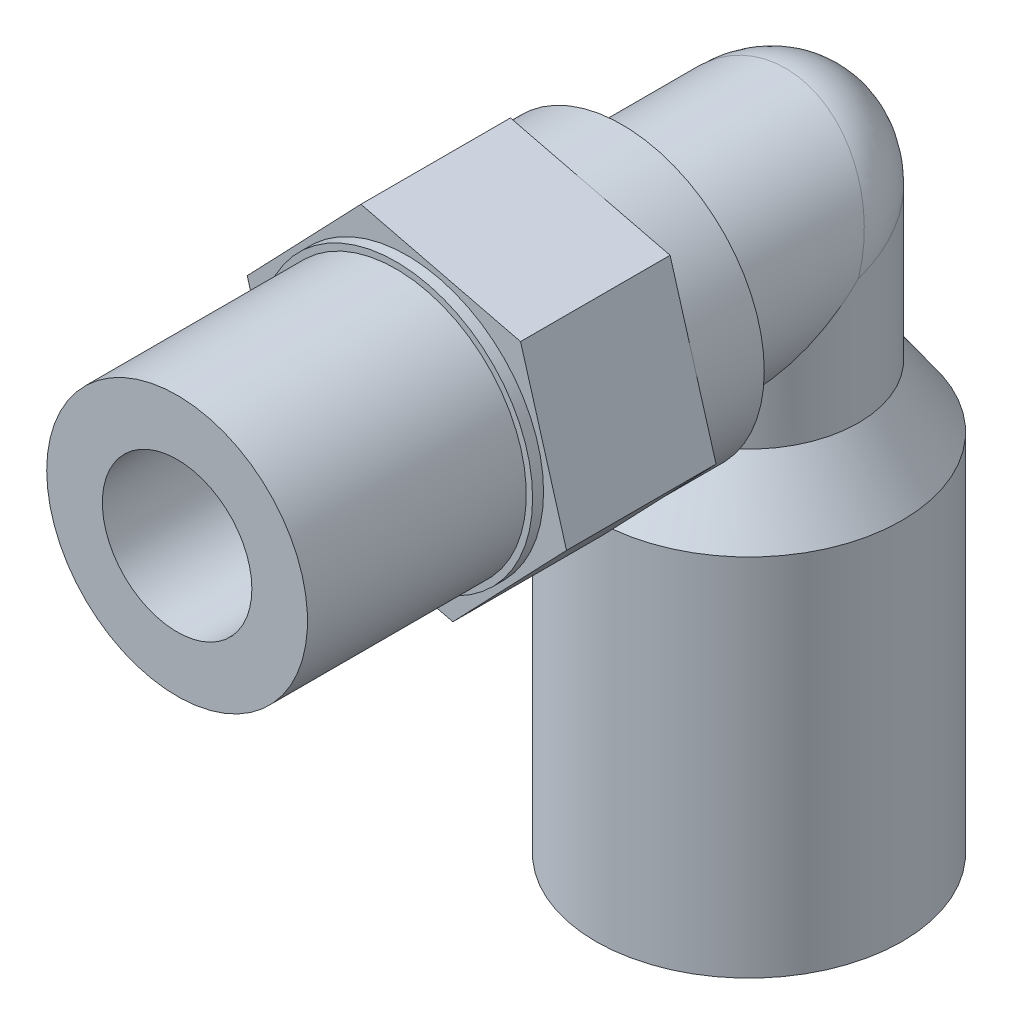
ISO-10303-21;
HEADER;
FILE_DESCRIPTION(('STEP AP214'),'2;1');
FILE_NAME('part.step','',(''),(''),'','','');
FILE_SCHEMA(('AUTOMOTIVE_DESIGN { 1 0 10303 214 1 1 1 1 }'));
ENDSEC;
DATA;
#1=APPLICATION_CONTEXT('core data for automotive mechanical design processes');
#2=APPLICATION_PROTOCOL_DEFINITION('international standard','automotive_design',2000,#1);
#3=PRODUCT_CONTEXT('',#1,'mechanical');
#4=PRODUCT('Part','Part','',(#3));
#5=PRODUCT_RELATED_PRODUCT_CATEGORY('part','',(#4));
#6=PRODUCT_DEFINITION_FORMATION('','',#4);
#7=PRODUCT_DEFINITION_CONTEXT('part definition',#1,'design');
#8=PRODUCT_DEFINITION('design','',#6,#7);
#9=PRODUCT_DEFINITION_SHAPE('','',#8);
#10=(LENGTH_UNIT() NAMED_UNIT(*) SI_UNIT(.MILLI.,.METRE.));
#11=(NAMED_UNIT(*) PLANE_ANGLE_UNIT() SI_UNIT($,.RADIAN.));
#12=(NAMED_UNIT(*) SI_UNIT($,.STERADIAN.) SOLID_ANGLE_UNIT());
#13=UNCERTAINTY_MEASURE_WITH_UNIT(LENGTH_MEASURE(1.E-05),#10,'distance_accuracy_value','');
#14=(GEOMETRIC_REPRESENTATION_CONTEXT(3) GLOBAL_UNCERTAINTY_ASSIGNED_CONTEXT((#13)) GLOBAL_UNIT_ASSIGNED_CONTEXT((#10,
#11,#12)) REPRESENTATION_CONTEXT('',''));
#15=CARTESIAN_POINT('',(0.,0.,0.));
#16=DIRECTION('',(0.,0.,1.));
#17=DIRECTION('',(1.,0.,0.));
#18=AXIS2_PLACEMENT_3D('',#15,#16,#17);
#19=CARTESIAN_POINT('',(-3.81,19.2282651112036,0.));
#20=CARTESIAN_POINT('',(-3.81,19.2282651112036,0.));
#21=CARTESIAN_POINT('',(-3.81,19.2282651112035,-1.58984427791554E-13));
#22=CARTESIAN_POINT('',(-3.80989951930153,19.4071070091371,-0.0596139659879938));
#23=CARTESIAN_POINT('',(-3.80986451505807,19.3475215329814,-0.119256421777965));
#24=CARTESIAN_POINT('',(-3.80989951930153,19.2878790771914,-0.178841897933663));
#25=CARTESIAN_POINT('',(-3.79739829653231,19.585971515167,-0.119235467999069));
#26=CARTESIAN_POINT('',(-3.80578781648035,19.4671366399743,-0.238871528770817));
#27=CARTESIAN_POINT('',(-3.79739829653231,19.3475005792025,-0.357706403963569));
#28=CARTESIAN_POINT('',(-3.74687046425324,19.9421975162533,-0.237977468357235));
#29=CARTESIAN_POINT('',(-3.78865822014945,19.70818757431,-0.47992246310655));
#30=CARTESIAN_POINT('',(-3.74687046425324,19.4662425795607,-0.713932405049908));
#31=CARTESIAN_POINT('',(-3.70879868989356,20.1195557885968,-0.297096892466663));
#32=CARTESIAN_POINT('',(-3.77547208224567,19.8304407835794,-0.602175672375938));
#33=CARTESIAN_POINT('',(-3.70879868989356,19.5253620036701,-0.891290677393387));
#34=CARTESIAN_POINT('',(-3.59587379595161,20.506662796264,-0.426132561684203));
#35=CARTESIAN_POINT('',(-3.73458643316093,20.1051301319713,-0.876865020767904));
#36=CARTESIAN_POINT('',(-3.59587379595161,19.6543976728876,-1.27839768506057));
#37=CARTESIAN_POINT('',(-3.51506733864817,20.7155729932286,-0.495769294007242));
#38=CARTESIAN_POINT('',(-3.70408795247643,20.2595904398537,-1.03132532865027));
#39=CARTESIAN_POINT('',(-3.51506733864817,19.7240344052107,-1.48730788202516));
#40=CARTESIAN_POINT('',(-3.31291088679013,21.1237244025668,-0.631819763793568));
#41=CARTESIAN_POINT('',(-3.62036033839914,20.5795933856956,-1.35132827449217));
#42=CARTESIAN_POINT('',(-3.31291088679013,19.860084874997,-1.89545929136337));
#43=CARTESIAN_POINT('',(-3.19150569594096,21.3229520262787,-0.698228971702944));
#44=CARTESIAN_POINT('',(-3.56608130216572,20.7469813609769,-1.51871624977347));
#45=CARTESIAN_POINT('',(-3.19150569594096,19.9264940829064,-2.09468691507523));
#46=CARTESIAN_POINT('',(-2.89282571424464,21.7211340519392,-0.830956313566475));
#47=CARTESIAN_POINT('',(-3.4131185082058,21.113399778271,-1.88513466706755));
#48=CARTESIAN_POINT('',(-2.89282571424464,20.0592214247699,-2.49286894073576));
#49=CARTESIAN_POINT('',(-2.71181077864827,21.9187490491746,-0.89682797928005));
#50=CARTESIAN_POINT('',(-3.30885447819662,21.315967677982,-2.08770256677855));
#51=CARTESIAN_POINT('',(-2.71181077864827,20.1250930904835,-2.69048393797113));
#52=CARTESIAN_POINT('',(-2.3989106145515,22.1914546173765,-0.987729835412889));
#53=CARTESIAN_POINT('',(-3.09137437449164,21.6307700190953,-2.40250490789189));
#54=CARTESIAN_POINT('',(-2.3989106145515,20.2159949466163,-2.96318950617306));
#55=CARTESIAN_POINT('',(-2.28759614522296,22.2784708299659,-1.01673523965011));
#56=CARTESIAN_POINT('',(-3.00628587997944,21.7399879970607,-2.51172288585723));
#57=CARTESIAN_POINT('',(-2.28759614522297,20.2450003508535,-3.05020571876251));
#58=CARTESIAN_POINT('',(-2.05079465019017,22.4424640169651,-1.0713996352924));
#59=CARTESIAN_POINT('',(-2.80563828566685,21.9615606930687,-2.73329558186529));
#60=CARTESIAN_POINT('',(-2.05079465019017,20.2996647464958,-3.21419890576168));
#61=CARTESIAN_POINT('',(-1.92530370337089,22.5194382010713,-1.09705769659626));
#62=CARTESIAN_POINT('',(-2.68924423977962,22.0739906262476,-2.84572551504421));
#63=CARTESIAN_POINT('',(-1.92530370337089,20.3253228077997,-3.29117308986783));
#64=CARTESIAN_POINT('',(-1.6633976727709,22.6591179909405,-1.14361762660483));
#65=CARTESIAN_POINT('',(-2.41971681411594,22.2939490621393,-3.06568395093587));
#66=CARTESIAN_POINT('',(-1.6633976727709,20.3718827378083,-3.43085287973712));
#67=CARTESIAN_POINT('',(-1.52727217038905,22.7220925702112,-1.16460915314153));
#68=CARTESIAN_POINT('',(-2.26657907084933,22.401307580247,-3.1730424690436));
#69=CARTESIAN_POINT('',(-1.52727217038905,20.392874264345,-3.49382745900772));
#70=CARTESIAN_POINT('',(-1.24337294002186,22.8328829650686,-1.20153928476019));
#71=CARTESIAN_POINT('',(-1.91559817593078,22.6035027150353,-3.37523760383184));
#72=CARTESIAN_POINT('',(-1.24337294002186,20.4298043959636,-3.60461785386515));
#73=CARTESIAN_POINT('',(-1.09562118834642,22.8807265611823,-1.21748715001821));
#74=CARTESIAN_POINT('',(-1.71753650191884,22.6976021096179,-3.4693369984145));
#75=CARTESIAN_POINT('',(-1.09562118834642,20.4457522612216,-3.65246144997887));
#76=CARTESIAN_POINT('',(-0.792310572157467,22.9582230731261,-1.24331932061588));
#77=CARTESIAN_POINT('',(-1.27936507237352,22.8581977623726,-3.6299326511692));
#78=CARTESIAN_POINT('',(-0.792310572157465,20.4715844318193,-3.7299579619227));
#79=CARTESIAN_POINT('',(-0.636837925828071,22.9880423878038,-1.2532590922364));
#80=CARTESIAN_POINT('',(-1.04043756914654,22.9238645541842,-3.69559944298077));
#81=CARTESIAN_POINT('',(-0.636837925828071,20.4815242034398,-3.75977727660032));
#82=CARTESIAN_POINT('',(-0.320908788290469,23.0280593340956,-1.26659807434617));
#83=CARTESIAN_POINT('',(-0.533347225283047,23.0143237149814,-3.78605860377794));
#84=CARTESIAN_POINT('',(-0.320908788290469,20.4948631855496,-3.79979422289217));
#85=CARTESIAN_POINT('',(-0.160454394145076,23.0382651112034,-1.27));
#86=CARTESIAN_POINT('',(-0.267393700037248,23.0382651112035,-3.81000000000003));
#87=CARTESIAN_POINT('',(-0.160454394145076,20.4982651112034,-3.81000000000001));
#88=CARTESIAN_POINT('',(0.160454394145712,23.0382651112034,-1.26999999999999));
#89=CARTESIAN_POINT('',(0.267393700038307,23.0382651112034,-3.80999999999997));
#90=CARTESIAN_POINT('',(0.160454394145712,20.4982651112034,-3.80999999999999));
#91=CARTESIAN_POINT('',(0.320908788291106,23.0280593340955,-1.26659807434615));
#92=CARTESIAN_POINT('',(0.533347225284095,23.0143237149813,-3.78605860377782));
#93=CARTESIAN_POINT('',(0.320908788291108,20.4948631855496,-3.79979422289212));
#94=CARTESIAN_POINT('',(0.636837925828706,22.9880423878036,-1.25325909223636));
#95=CARTESIAN_POINT('',(1.04043756914753,22.923864554184,-3.69559944298053));
#96=CARTESIAN_POINT('',(0.636837925828707,20.4815242034398,-3.75977727660021));
#97=CARTESIAN_POINT('',(0.792310572158097,22.958223073126,-1.24331932061584));
#98=CARTESIAN_POINT('',(1.27936507237447,22.8581977623723,-3.62993265116891));
#99=CARTESIAN_POINT('',(0.792310572158097,20.4715844318193,-3.72995796192256));
#100=CARTESIAN_POINT('',(1.09562118834704,22.8807265611821,-1.21748715001815));
#101=CARTESIAN_POINT('',(1.71753650191969,22.6976021096176,-3.46933699841413));
#102=CARTESIAN_POINT('',(1.09562118834704,20.4457522612216,-3.65246144997869));
#103=CARTESIAN_POINT('',(1.24337294002247,22.8328829650684,-1.20153928476012));
#104=CARTESIAN_POINT('',(1.91559817593157,22.6035027150349,-3.37523760383144));
#105=CARTESIAN_POINT('',(1.24337294002247,20.4298043959636,-3.60461785386494));
#106=CARTESIAN_POINT('',(1.52727217038963,22.7220925702109,-1.16460915314144));
#107=CARTESIAN_POINT('',(2.26657907085,22.4013075802466,-3.17304246904316));
#108=CARTESIAN_POINT('',(1.52727217038963,20.3928742643449,-3.49382745900747));
#109=CARTESIAN_POINT('',(1.66339767277147,22.6591179909403,-1.14361762660474));
#110=CARTESIAN_POINT('',(2.41971681411657,22.2939490621388,-3.06568395093541));
#111=CARTESIAN_POINT('',(1.66339767277147,20.3718827378082,-3.43085287973684));
#112=CARTESIAN_POINT('',(1.92530370337144,22.5194382010709,-1.09705769659615));
#113=CARTESIAN_POINT('',(2.68924423978015,22.0739906262472,-2.84572551504373));
#114=CARTESIAN_POINT('',(1.92530370337144,20.3253228077996,-3.29117308986751));
#115=CARTESIAN_POINT('',(2.0507946501907,22.4424640169648,-1.07139963529229));
#116=CARTESIAN_POINT('',(2.80563828566733,21.9615606930682,-2.73329558186481));
#117=CARTESIAN_POINT('',(2.0507946501907,20.2996647464957,-3.21419890576135));
#118=CARTESIAN_POINT('',(2.28759614522347,22.2784708299656,-1.01673523964998));
#119=CARTESIAN_POINT('',(3.00628587997984,21.7399879970602,-2.51172288585674));
#120=CARTESIAN_POINT('',(2.28759614522347,20.2450003508534,-3.05020571876213));
#121=CARTESIAN_POINT('',(2.39891061455199,22.1914546173761,-0.987729835412756));
#122=CARTESIAN_POINT('',(3.091374374492,21.6307700190948,-2.4025049078914));
#123=CARTESIAN_POINT('',(2.39891061455199,20.2159949466162,-2.96318950617266));
#124=CARTESIAN_POINT('',(2.71181077864872,21.9187490491741,-0.896827979279898));
#125=CARTESIAN_POINT('',(3.30885447819689,21.3159676779815,-2.08770256677807));
#126=CARTESIAN_POINT('',(2.71181077864872,20.1250930904833,-2.69048393797067));
#127=CARTESIAN_POINT('',(2.89282571424505,21.7211340519387,-0.830956313566314));
#128=CARTESIAN_POINT('',(3.41311850820603,21.1133997782705,-1.88513466706707));
#129=CARTESIAN_POINT('',(2.89282571424505,20.0592214247697,-2.49286894073528));
#130=CARTESIAN_POINT('',(3.19150569594131,21.3229520262781,-0.69822897170277));
#131=CARTESIAN_POINT('',(3.56608130216588,20.7469813609764,-1.51871624977301));
#132=CARTESIAN_POINT('',(3.19150569594131,19.9264940829062,-2.09468691507471));
#133=CARTESIAN_POINT('',(3.31291088679044,21.1237244025663,-0.631819763793388));
#134=CARTESIAN_POINT('',(3.62036033839928,20.5795933856952,-1.35132827449173));
#135=CARTESIAN_POINT('',(3.31291088679044,19.8600848749968,-1.89545929136283));
#136=CARTESIAN_POINT('',(3.51506733864842,20.715572993228,-0.49576929400705));
#137=CARTESIAN_POINT('',(3.70408795247652,20.2595904398533,-1.03132532864984));
#138=CARTESIAN_POINT('',(3.51506733864842,19.7240344052105,-1.48730788202459));
#139=CARTESIAN_POINT('',(3.59587379595182,20.5066627962634,-0.426132561684005));
#140=CARTESIAN_POINT('',(3.73458643316101,20.1051301319709,-0.876865020767479));
#141=CARTESIAN_POINT('',(3.59587379595182,19.6543976728874,-1.27839768505998));
#142=CARTESIAN_POINT('',(3.7087986898937,20.1195557885962,-0.297096892466457));
#143=CARTESIAN_POINT('',(3.77547208224572,19.830440783579,-0.602175672375504));
#144=CARTESIAN_POINT('',(3.70879868989371,19.5253620036699,-0.89129067739277));
#145=CARTESIAN_POINT('',(3.74687046425336,19.9421975162527,-0.237977468357027));
#146=CARTESIAN_POINT('',(3.78865822014949,19.7081875743096,-0.479922463106103));
#147=CARTESIAN_POINT('',(3.74687046425336,19.4662425795605,-0.713932405049286));
#148=CARTESIAN_POINT('',(3.79739829653237,19.5859715151664,-0.119235467998859));
#149=CARTESIAN_POINT('',(3.80578781648037,19.4671366399738,-0.238871528770415));
#150=CARTESIAN_POINT('',(3.79739829653237,19.3475005792023,-0.35770640396294));
#151=CARTESIAN_POINT('',(3.80989951930156,19.4071070091365,-0.0596139659877838));
#152=CARTESIAN_POINT('',(3.80986451505808,19.3475215329809,-0.119256421777621));
#153=CARTESIAN_POINT('',(3.80989951930156,19.2878790771912,-0.178841897933033));
#154=CARTESIAN_POINT('',(3.81,19.228265111203,1.57856441198535E-13));
#155=CARTESIAN_POINT('',(3.81,19.228265111203,1.57856441198535E-13));
#156=CARTESIAN_POINT('',(3.81,19.2282651112033,4.73226096813424E-13));
#157=(BOUNDED_SURFACE() B_SPLINE_SURFACE(3,2,((#19,#20,#21),(#22,#23,#24),(#25,#26,#27),(#28,
#29,#30),(#31,#32,#33),(#34,#35,#36),(#37,#38,#39),(#40,#41,#42),(#43,#44,#45),(#46,#47,#48),
(#49,#50,#51),(#52,#53,#54),(#55,#56,#57),(#58,#59,#60),(#61,#62,#63),(#64,#65,#66),(#67,#68,
#69),(#70,#71,#72),(#73,#74,#75),(#76,#77,#78),(#79,#80,#81),(#82,#83,#84),(#85,#86,#87),(#88,
#89,#90),(#91,#92,#93),(#94,#95,#96),(#97,#98,#99),(#100,#101,#102),(#103,#104,#105),(#106,#107,
#108),(#109,#110,#111),(#112,#113,#114),(#115,#116,#117),(#118,#119,#120),(#121,#122,#123),
(#124,#125,#126),(#127,#128,#129),(#130,#131,#132),(#133,#134,#135),(#136,#137,#138),(#139,#140,
#141),(#142,#143,#144),(#145,#146,#147),(#148,#149,#150),(#151,#152,#153),(#154,#155,#156)),
.UNSPECIFIED.,.F.,.F.,.F.) B_SPLINE_SURFACE_WITH_KNOTS((4,2,2,2,2,2,2,2,2,2,2,2,2,2,2,2,2,2,2,2,
2,2,4),(3,3),(0.,0.252828291534152,0.506104328074288,0.811459178843347,1.11723087629318,
1.44786517233833,1.61347881331245,1.77913837454431,1.94126976086502,2.10310172177201,
2.26341588832644,2.4236634620776,2.58391103582876,2.7442252023832,2.90605716329019,
3.0681885496109,3.23384811084278,3.3994617518169,3.73009604786207,4.03586774531192,
4.34122259608099,4.59449863262113,4.84732692415528),(0.,1.),
.UNSPECIFIED.) GEOMETRIC_REPRESENTATION_ITEM() RATIONAL_B_SPLINE_SURFACE(((1.,1.,1.),(1.,
1.0000055105626,1.),(1.,0.998346900050613,1.),(1.,0.991739425044911,1.),(1.,0.986784738894076,
1.),(1.,0.972270257684219,1.),(1.,0.961973040219971,1.),(1.,0.936933889145659,1.),(1.,
0.922185907144451,1.),(1.,0.887537504496006,1.),(1.,0.867315639914291,1.),(1.,0.835444591187483,
1.),(1.,0.824554102943035,1.),(1.,0.802806350590835,1.),(1.,0.791949096532519,1.),(1.,
0.771253688375704,1.),(1.,0.761398754531407,1.),(1.,0.743397714788571,1.),(1.,0.735248486626448,
1.),(1.,0.721724398682415,1.),(1.,0.716324235398779,1.),(1.,0.70901615150522,1.),(1.,
0.707106781186545,1.),(1.,0.70710678118655,1.),(1.,0.70901615150523,1.),(1.,0.716324235398799,
1.),(1.,0.721724398682439,1.),(1.,0.73524848662648,1.),(1.,0.743397714788606,1.),(1.,
0.761398754531447,1.),(1.,0.771253688375746,1.),(1.,0.791949096532565,1.),(1.,0.802806350590883,
1.),(1.,0.824554102943084,1.),(1.,0.835444591187532,1.),(1.,0.867315639914339,1.),(1.,
0.887537504496052,1.),(1.,0.922185907144493,1.),(1.,0.936933889145697,1.),(1.,0.961973040220002,
1.),(1.,0.972270257684246,1.),(1.,0.986784738894095,1.),(1.,0.991739425044926,1.),(1.,
0.99834690005062,1.),(1.,1.0000055105626,1.),(1.,1.,1.))) REPRESENTATION_ITEM('') SURFACE());
#158=CARTESIAN_POINT('',(0.,19.2282651112034,0.));
#159=DIRECTION('',(0.,0.948683298050514,0.316227766016838));
#160=DIRECTION('',(0.,-0.316227766016838,0.948683298050514));
#161=AXIS2_PLACEMENT_3D('',#158,#159,#160);
#162=ELLIPSE('',#161,4.01609262841384,3.81);
#163=CARTESIAN_POINT('',(-3.81,19.2282651112034,0.));
#164=VERTEX_POINT('',#163);
#165=CARTESIAN_POINT('',(3.81,19.2282651112034,0.));
#166=VERTEX_POINT('',#165);
#167=EDGE_CURVE('E48',#164,#166,#162,.F.);
#168=ORIENTED_EDGE('',*,*,#167,.F.);
#169=CARTESIAN_POINT('',(0.,19.2282651112034,0.));
#170=DIRECTION('',(0.,0.316227766016838,0.948683298050514));
#171=DIRECTION('',(0.,-0.948683298050514,0.316227766016838));
#172=AXIS2_PLACEMENT_3D('',#169,#170,#171);
#173=ELLIPSE('',#172,4.01609262841384,3.81);
#174=EDGE_CURVE('E12',#166,#164,#173,.T.);
#175=ORIENTED_EDGE('',*,*,#174,.F.);
#176=EDGE_LOOP('',(#168,#175));
#177=FACE_BOUND('',#176,.T.);
#178=ADVANCED_FACE('F37',(#177),#157,.T.);
#179=CARTESIAN_POINT('',(0.,19.2282651112035,12.2943700006345));
#180=DIRECTION('',(0.,0.,1.));
#181=DIRECTION('',(1.,0.,0.));
#182=AXIS2_PLACEMENT_3D('',#179,#180,#181);
#183=PLANE('',#182);
#184=CARTESIAN_POINT('',(0.,19.2282651112035,12.2943700006345));
#185=DIRECTION('',(0.,0.,1.));
#186=DIRECTION('',(1.,0.,0.));
#187=AXIS2_PLACEMENT_3D('',#184,#185,#186);
#188=CIRCLE('',#187,4.76030606236146);
#189=CARTESIAN_POINT('',(4.76030606236146,19.2282651112035,12.2943700006345));
#190=VERTEX_POINT('',#189);
#191=EDGE_CURVE('E412',#190,#190,#188,.T.);
#192=ORIENTED_EDGE('',*,*,#191,.T.);
#193=EDGE_LOOP('',(#192));
#194=FACE_BOUND('',#193,.T.);
#195=CARTESIAN_POINT('',(0.,19.2282651112035,12.2943700006345));
#196=DIRECTION('',(0.,0.,1.));
#197=DIRECTION('',(1.,0.,0.));
#198=AXIS2_PLACEMENT_3D('',#195,#196,#197);
#199=CIRCLE('',#198,4.54095155865772);
#200=CARTESIAN_POINT('',(-4.54095155865772,19.2282651112035,12.2943700006345));
#201=VERTEX_POINT('',#200);
#202=EDGE_CURVE('E404',#201,#201,#199,.T.);
#203=ORIENTED_EDGE('',*,*,#202,.F.);
#204=EDGE_LOOP('',(#203));
#205=FACE_BOUND('',#204,.T.);
#206=ADVANCED_FACE('F178',(#194,#205),#183,.T.);
#207=CARTESIAN_POINT('',(0.,0.,11.9133700006345));
#208=DIRECTION('',(0.,0.,1.));
#209=DIRECTION('',(1.,0.,0.));
#210=AXIS2_PLACEMENT_3D('',#207,#208,#209);
#211=PLANE('',#210);
#212=DIRECTION('',(0.279651343994425,-0.960101622643203,0.));
#213=VECTOR('',#212,1.);
#214=CARTESIAN_POINT('',(-5.5599115906275,20.5898573876737,11.9133700006345));
#215=LINE('',#214,#213);
#216=CARTESIAN_POINT('',(-5.5599115906275,20.5898573876737,11.9133700006345));
#217=VERTEX_POINT('',#216);
#218=CARTESIAN_POINT('',(-3.95912929633368,15.0940365691596,11.9133700006345));
#219=VERTEX_POINT('',#218);
#220=EDGE_CURVE('E106',#217,#219,#215,.T.);
#221=ORIENTED_EDGE('',*,*,#220,.T.);
#222=DIRECTION('',(0.971298067420887,-0.237865643219968,0.));
#223=VECTOR('',#222,1.);
#224=CARTESIAN_POINT('',(-3.95912929633368,15.0940365691596,11.9133700006345));
#225=LINE('',#224,#223);
#226=CARTESIAN_POINT('',(1.60078229429382,13.7324442926893,11.9133700006345));
#227=VERTEX_POINT('',#226);
#228=EDGE_CURVE('E95',#219,#227,#225,.T.);
#229=ORIENTED_EDGE('',*,*,#228,.T.);
#230=DIRECTION('',(0.691646723426462,0.722235979423235,0.));
#231=VECTOR('',#230,1.);
#232=CARTESIAN_POINT('',(1.60078229429382,13.7324442926893,11.9133700006345));
#233=LINE('',#232,#231);
#234=CARTESIAN_POINT('',(5.55991159062749,17.8666728347332,11.9133700006345));
#235=VERTEX_POINT('',#234);
#236=EDGE_CURVE('E105',#227,#235,#233,.T.);
#237=ORIENTED_EDGE('',*,*,#236,.T.);
#238=DIRECTION('',(-0.279651343994426,0.960101622643203,0.));
#239=VECTOR('',#238,1.);
#240=CARTESIAN_POINT('',(5.55991159062749,17.8666728347332,11.9133700006345));
#241=LINE('',#240,#239);
#242=CARTESIAN_POINT('',(3.95912929633367,23.3624936532473,11.9133700006345));
#243=VERTEX_POINT('',#242);
#244=EDGE_CURVE('E418',#235,#243,#241,.T.);
#245=ORIENTED_EDGE('',*,*,#244,.T.);
#246=DIRECTION('',(-0.971298067420888,0.237865643219968,0.));
#247=VECTOR('',#246,1.);
#248=CARTESIAN_POINT('',(3.95912929633367,23.3624936532473,11.9133700006345));
#249=LINE('',#248,#247);
#250=CARTESIAN_POINT('',(-1.60078229429382,24.7240859297175,11.9133700006345));
#251=VERTEX_POINT('',#250);
#252=EDGE_CURVE('E420',#243,#251,#249,.T.);
#253=ORIENTED_EDGE('',*,*,#252,.T.);
#254=DIRECTION('',(-0.691646723426462,-0.722235979423235,0.));
#255=VECTOR('',#254,1.);
#256=CARTESIAN_POINT('',(-1.60078229429382,24.7240859297175,11.9133700006345));
#257=LINE('',#256,#255);
#258=EDGE_CURVE('E112',#251,#217,#257,.T.);
#259=ORIENTED_EDGE('',*,*,#258,.T.);
#260=EDGE_LOOP('',(#221,#229,#237,#245,#253,#259));
#261=FACE_BOUND('',#260,.T.);
#262=CARTESIAN_POINT('',(0.,19.2282651112035,11.9133700006345));
#263=DIRECTION('',(0.,0.,1.));
#264=DIRECTION('',(1.,0.,0.));
#265=AXIS2_PLACEMENT_3D('',#262,#263,#264);
#266=CIRCLE('',#265,4.76030606236146);
#267=CARTESIAN_POINT('',(4.76030606236146,19.2282651112035,11.9133700006345));
#268=VERTEX_POINT('',#267);
#269=EDGE_CURVE('E409',#268,#268,#266,.T.);
#270=ORIENTED_EDGE('',*,*,#269,.F.);
#271=EDGE_LOOP('',(#270));
#272=FACE_BOUND('',#271,.T.);
#273=ADVANCED_FACE('F109',(#261,#272),#211,.T.);
#274=CARTESIAN_POINT('',(0.,30.0045724564864,0.));
#275=DIRECTION('',(0.,-1.,0.));
#276=DIRECTION('',(1.,0.,0.));
#277=AXIS2_PLACEMENT_3D('',#274,#275,#276);
#278=CYLINDRICAL_SURFACE('',#277,3.81);
#279=CARTESIAN_POINT('',(0.,19.2282651112034,0.));
#280=DIRECTION('',(0.,0.707106781186548,0.707106781186548));
#281=DIRECTION('',(0.,-0.707106781186548,0.707106781186548));
#282=AXIS2_PLACEMENT_3D('',#279,#280,#281);
#283=ELLIPSE('',#282,5.38815367264149,3.81);
#284=EDGE_CURVE('E135',#164,#166,#283,.T.);
#285=ORIENTED_EDGE('',*,*,#284,.F.);
#286=ORIENTED_EDGE('',*,*,#167,.T.);
#287=EDGE_LOOP('',(#285,#286));
#288=FACE_BOUND('',#287,.T.);
#289=CARTESIAN_POINT('',(0.,14.876497562275,0.));
#290=DIRECTION('',(0.,-1.,0.));
#291=DIRECTION('',(0.,0.,-1.));
#292=AXIS2_PLACEMENT_3D('',#289,#290,#291);
#293=CIRCLE('',#292,3.81);
#294=CARTESIAN_POINT('',(0.,14.876497562275,-3.81));
#295=VERTEX_POINT('',#294);
#296=EDGE_CURVE('E141',#295,#295,#293,.T.);
#297=ORIENTED_EDGE('',*,*,#296,.F.);
#298=EDGE_LOOP('',(#297));
#299=FACE_BOUND('',#298,.T.);
#300=ADVANCED_FACE('F148',(#288,#299),#278,.T.);
#301=CARTESIAN_POINT('',(0.,19.2282651112034,0.));
#302=DIRECTION('',(0.,0.,1.));
#303=DIRECTION('',(1.,0.,0.));
#304=AXIS2_PLACEMENT_3D('',#301,#302,#303);
#305=CYLINDRICAL_SURFACE('',#304,3.81);
#306=ORIENTED_EDGE('',*,*,#284,.T.);
#307=ORIENTED_EDGE('',*,*,#174,.T.);
#308=EDGE_LOOP('',(#306,#307));
#309=FACE_BOUND('',#308,.T.);
#310=CARTESIAN_POINT('',(0.,19.2282651112034,4.42037000063448));
#311=DIRECTION('',(0.,0.,1.));
#312=DIRECTION('',(1.,0.,0.));
#313=AXIS2_PLACEMENT_3D('',#310,#311,#312);
#314=CIRCLE('',#313,3.81);
#315=CARTESIAN_POINT('',(3.81,19.2282651112034,4.42037000063448));
#316=VERTEX_POINT('',#315);
#317=EDGE_CURVE('E131',#316,#316,#314,.F.);
#318=ORIENTED_EDGE('',*,*,#317,.T.);
#319=EDGE_LOOP('',(#318));
#320=FACE_BOUND('',#319,.T.);
#321=ADVANCED_FACE('F150',(#309,#320),#305,.T.);
#322=CARTESIAN_POINT('',(0.,12.7,0.));
#323=DIRECTION('',(0.,-1.,0.));
#324=DIRECTION('',(0.,0.,1.));
#325=AXIS2_PLACEMENT_3D('',#322,#323,#324);
#326=CONICAL_SURFACE('',#325,5.334,0.610865238198017);
#327=CARTESIAN_POINT('',(0.,12.7,0.));
#328=DIRECTION('',(0.,1.,0.));
#329=DIRECTION('',(0.,0.,1.));
#330=AXIS2_PLACEMENT_3D('',#327,#328,#329);
#331=CIRCLE('',#330,5.334);
#332=CARTESIAN_POINT('',(0.,12.7,5.334));
#333=VERTEX_POINT('',#332);
#334=EDGE_CURVE('E138',#333,#333,#331,.T.);
#335=ORIENTED_EDGE('',*,*,#334,.T.);
#336=EDGE_LOOP('',(#335));
#337=FACE_BOUND('',#336,.T.);
#338=ORIENTED_EDGE('',*,*,#296,.T.);
#339=EDGE_LOOP('',(#338));
#340=FACE_BOUND('',#339,.T.);
#341=ADVANCED_FACE('F153',(#337,#340),#326,.T.);
#342=CARTESIAN_POINT('',(0.,0.,0.));
#343=DIRECTION('',(0.,1.,0.));
#344=DIRECTION('',(0.,0.,1.));
#345=AXIS2_PLACEMENT_3D('',#342,#343,#344);
#346=PLANE('',#345);
#347=CARTESIAN_POINT('',(0.,0.,0.));
#348=DIRECTION('',(0.,-1.,0.));
#349=DIRECTION('',(0.,0.,-1.));
#350=AXIS2_PLACEMENT_3D('',#347,#348,#349);
#351=CIRCLE('',#350,3.302);
#352=CARTESIAN_POINT('',(0.,0.,-3.302));
#353=VERTEX_POINT('',#352);
#354=EDGE_CURVE('E394',#353,#353,#351,.T.);
#355=ORIENTED_EDGE('',*,*,#354,.F.);
#356=EDGE_LOOP('',(#355));
#357=FACE_BOUND('',#356,.T.);
#358=CARTESIAN_POINT('',(0.,0.,0.));
#359=DIRECTION('',(0.,1.,0.));
#360=DIRECTION('',(0.,0.,1.));
#361=AXIS2_PLACEMENT_3D('',#358,#359,#360);
#362=CIRCLE('',#361,5.334);
#363=CARTESIAN_POINT('',(0.,0.,5.334));
#364=VERTEX_POINT('',#363);
#365=EDGE_CURVE('E137',#364,#364,#362,.T.);
#366=ORIENTED_EDGE('',*,*,#365,.F.);
#367=EDGE_LOOP('',(#366));
#368=FACE_BOUND('',#367,.T.);
#369=ADVANCED_FACE('F172',(#357,#368),#346,.F.);
#370=CARTESIAN_POINT('',(0.,12.7,0.));
#371=DIRECTION('',(0.,-1.,0.));
#372=DIRECTION('',(0.,0.,-1.));
#373=AXIS2_PLACEMENT_3D('',#370,#371,#372);
#374=CYLINDRICAL_SURFACE('',#373,5.334);
#375=ORIENTED_EDGE('',*,*,#334,.F.);
#376=EDGE_LOOP('',(#375));
#377=FACE_BOUND('',#376,.T.);
#378=ORIENTED_EDGE('',*,*,#365,.T.);
#379=EDGE_LOOP('',(#378));
#380=FACE_BOUND('',#379,.T.);
#381=ADVANCED_FACE('F166',(#377,#380),#374,.T.);
#382=CARTESIAN_POINT('',(0.,19.2282651112034,6.70637000063448));
#383=DIRECTION('',(0.,0.,-1.));
#384=DIRECTION('',(-1.,0.,0.));
#385=AXIS2_PLACEMENT_3D('',#382,#383,#384);
#386=CYLINDRICAL_SURFACE('',#385,4.953);
#387=CARTESIAN_POINT('',(0.,19.2282651112034,6.70637000063448));
#388=DIRECTION('',(0.,0.,1.));
#389=DIRECTION('',(1.,0.,0.));
#390=AXIS2_PLACEMENT_3D('',#387,#388,#389);
#391=CIRCLE('',#390,4.953);
#392=CARTESIAN_POINT('',(4.953,19.2282651112034,6.70637000063448));
#393=VERTEX_POINT('',#392);
#394=EDGE_CURVE('E124',#393,#393,#391,.T.);
#395=ORIENTED_EDGE('',*,*,#394,.F.);
#396=EDGE_LOOP('',(#395));
#397=FACE_BOUND('',#396,.T.);
#398=CARTESIAN_POINT('',(0.,19.2282651112034,4.42037000063448));
#399=DIRECTION('',(0.,0.,1.));
#400=DIRECTION('',(1.,0.,0.));
#401=AXIS2_PLACEMENT_3D('',#398,#399,#400);
#402=CIRCLE('',#401,4.953);
#403=CARTESIAN_POINT('',(4.953,19.2282651112034,4.42037000063448));
#404=VERTEX_POINT('',#403);
#405=EDGE_CURVE('E121',#404,#404,#402,.T.);
#406=ORIENTED_EDGE('',*,*,#405,.T.);
#407=EDGE_LOOP('',(#406));
#408=FACE_BOUND('',#407,.T.);
#409=ADVANCED_FACE('F161',(#397,#408),#386,.T.);
#410=CARTESIAN_POINT('',(0.,19.2282651112034,4.42037000063448));
#411=DIRECTION('',(0.,0.,1.));
#412=DIRECTION('',(1.,0.,0.));
#413=AXIS2_PLACEMENT_3D('',#410,#411,#412);
#414=PLANE('',#413);
#415=ORIENTED_EDGE('',*,*,#317,.F.);
#416=EDGE_LOOP('',(#415));
#417=FACE_BOUND('',#416,.T.);
#418=ORIENTED_EDGE('',*,*,#405,.F.);
#419=EDGE_LOOP('',(#418));
#420=FACE_BOUND('',#419,.T.);
#421=ADVANCED_FACE('F157',(#417,#420),#414,.F.);
#422=CARTESIAN_POINT('',(0.,0.,6.70637000063448));
#423=DIRECTION('',(0.,0.,1.));
#424=DIRECTION('',(1.,0.,0.));
#425=AXIS2_PLACEMENT_3D('',#422,#423,#424);
#426=PLANE('',#425);
#427=DIRECTION('',(0.279651343994425,-0.960101622643203,0.));
#428=VECTOR('',#427,1.);
#429=CARTESIAN_POINT('',(-5.5599115906275,20.5898573876737,6.70637000063448));
#430=LINE('',#429,#428);
#431=CARTESIAN_POINT('',(-5.5599115906275,20.5898573876737,6.70637000063448));
#432=VERTEX_POINT('',#431);
#433=CARTESIAN_POINT('',(-3.95912929633368,15.0940365691596,6.70637000063448));
#434=VERTEX_POINT('',#433);
#435=EDGE_CURVE('E120',#432,#434,#430,.T.);
#436=ORIENTED_EDGE('',*,*,#435,.F.);
#437=DIRECTION('',(-0.691646723426462,-0.722235979423235,0.));
#438=VECTOR('',#437,1.);
#439=CARTESIAN_POINT('',(-1.60078229429382,24.7240859297175,6.70637000063448));
#440=LINE('',#439,#438);
#441=CARTESIAN_POINT('',(-1.60078229429382,24.7240859297175,6.70637000063448));
#442=VERTEX_POINT('',#441);
#443=EDGE_CURVE('E116',#442,#432,#440,.T.);
#444=ORIENTED_EDGE('',*,*,#443,.F.);
#445=DIRECTION('',(-0.971298067420888,0.237865643219968,0.));
#446=VECTOR('',#445,1.);
#447=CARTESIAN_POINT('',(3.95912929633367,23.3624936532473,6.70637000063448));
#448=LINE('',#447,#446);
#449=CARTESIAN_POINT('',(3.95912929633367,23.3624936532473,6.70637000063448));
#450=VERTEX_POINT('',#449);
#451=EDGE_CURVE('E431',#450,#442,#448,.T.);
#452=ORIENTED_EDGE('',*,*,#451,.F.);
#453=DIRECTION('',(-0.279651343994426,0.960101622643203,0.));
#454=VECTOR('',#453,1.);
#455=CARTESIAN_POINT('',(5.55991159062749,17.8666728347332,6.70637000063448));
#456=LINE('',#455,#454);
#457=CARTESIAN_POINT('',(5.55991159062749,17.8666728347332,6.70637000063448));
#458=VERTEX_POINT('',#457);
#459=EDGE_CURVE('E429',#458,#450,#456,.T.);
#460=ORIENTED_EDGE('',*,*,#459,.F.);
#461=DIRECTION('',(0.691646723426462,0.722235979423235,0.));
#462=VECTOR('',#461,1.);
#463=CARTESIAN_POINT('',(1.60078229429382,13.7324442926893,6.70637000063448));
#464=LINE('',#463,#462);
#465=CARTESIAN_POINT('',(1.60078229429382,13.7324442926893,6.70637000063448));
#466=VERTEX_POINT('',#465);
#467=EDGE_CURVE('E427',#466,#458,#464,.T.);
#468=ORIENTED_EDGE('',*,*,#467,.F.);
#469=DIRECTION('',(0.971298067420887,-0.237865643219968,0.));
#470=VECTOR('',#469,1.);
#471=CARTESIAN_POINT('',(-3.95912929633368,15.0940365691596,6.70637000063448));
#472=LINE('',#471,#470);
#473=EDGE_CURVE('E425',#434,#466,#472,.T.);
#474=ORIENTED_EDGE('',*,*,#473,.F.);
#475=EDGE_LOOP('',(#436,#444,#452,#460,#468,#474));
#476=FACE_BOUND('',#475,.T.);
#477=ORIENTED_EDGE('',*,*,#394,.T.);
#478=EDGE_LOOP('',(#477));
#479=FACE_BOUND('',#478,.T.);
#480=ADVANCED_FACE('F160',(#476,#479),#426,.F.);
#481=CARTESIAN_POINT('',(-5.5599115906275,20.5898573876737,11.9133700006345));
#482=DIRECTION('',(0.960101622643203,0.279651343994425,0.));
#483=DIRECTION('',(-0.279651343994425,0.960101622643203,0.));
#484=AXIS2_PLACEMENT_3D('',#481,#482,#483);
#485=PLANE('',#484);
#486=ORIENTED_EDGE('',*,*,#435,.T.);
#487=DIRECTION('',(0.,0.,-1.));
#488=VECTOR('',#487,1.);
#489=CARTESIAN_POINT('',(-3.95912929633368,15.0940365691596,11.9133700006345));
#490=LINE('',#489,#488);
#491=EDGE_CURVE('E99',#219,#434,#490,.T.);
#492=ORIENTED_EDGE('',*,*,#491,.F.);
#493=ORIENTED_EDGE('',*,*,#220,.F.);
#494=DIRECTION('',(0.,0.,-1.));
#495=VECTOR('',#494,1.);
#496=CARTESIAN_POINT('',(-5.5599115906275,20.5898573876737,11.9133700006345));
#497=LINE('',#496,#495);
#498=EDGE_CURVE('E423',#217,#432,#497,.T.);
#499=ORIENTED_EDGE('',*,*,#498,.T.);
#500=EDGE_LOOP('',(#486,#492,#493,#499));
#501=FACE_BOUND('',#500,.T.);
#502=ADVANCED_FACE('F118',(#501),#485,.F.);
#503=CARTESIAN_POINT('',(-3.95912929633368,15.0940365691596,11.9133700006345));
#504=DIRECTION('',(0.237865643219968,0.971298067420887,0.));
#505=DIRECTION('',(-0.971298067420887,0.237865643219968,0.));
#506=AXIS2_PLACEMENT_3D('',#503,#504,#505);
#507=PLANE('',#506);
#508=ORIENTED_EDGE('',*,*,#473,.T.);
#509=DIRECTION('',(0.,0.,-1.));
#510=VECTOR('',#509,1.);
#511=CARTESIAN_POINT('',(1.60078229429382,13.7324442926893,11.9133700006345));
#512=LINE('',#511,#510);
#513=EDGE_CURVE('E102',#227,#466,#512,.T.);
#514=ORIENTED_EDGE('',*,*,#513,.F.);
#515=ORIENTED_EDGE('',*,*,#228,.F.);
#516=ORIENTED_EDGE('',*,*,#491,.T.);
#517=EDGE_LOOP('',(#508,#514,#515,#516));
#518=FACE_BOUND('',#517,.T.);
#519=ADVANCED_FACE('F97',(#518),#507,.F.);
#520=CARTESIAN_POINT('',(1.60078229429382,13.7324442926893,11.9133700006345));
#521=DIRECTION('',(-0.722235979423235,0.691646723426462,0.));
#522=DIRECTION('',(-0.691646723426462,-0.722235979423235,0.));
#523=AXIS2_PLACEMENT_3D('',#520,#521,#522);
#524=PLANE('',#523);
#525=ORIENTED_EDGE('',*,*,#467,.T.);
#526=DIRECTION('',(0.,0.,-1.));
#527=VECTOR('',#526,1.);
#528=CARTESIAN_POINT('',(5.55991159062749,17.8666728347332,11.9133700006345));
#529=LINE('',#528,#527);
#530=EDGE_CURVE('E126',#235,#458,#529,.T.);
#531=ORIENTED_EDGE('',*,*,#530,.F.);
#532=ORIENTED_EDGE('',*,*,#236,.F.);
#533=ORIENTED_EDGE('',*,*,#513,.T.);
#534=EDGE_LOOP('',(#525,#531,#532,#533));
#535=FACE_BOUND('',#534,.T.);
#536=ADVANCED_FACE('F261',(#535),#524,.F.);
#537=CARTESIAN_POINT('',(5.55991159062749,17.8666728347332,11.9133700006345));
#538=DIRECTION('',(-0.960101622643203,-0.279651343994426,0.));
#539=DIRECTION('',(0.279651343994426,-0.960101622643203,0.));
#540=AXIS2_PLACEMENT_3D('',#537,#538,#539);
#541=PLANE('',#540);
#542=ORIENTED_EDGE('',*,*,#459,.T.);
#543=DIRECTION('',(0.,0.,-1.));
#544=VECTOR('',#543,1.);
#545=CARTESIAN_POINT('',(3.95912929633367,23.3624936532473,11.9133700006345));
#546=LINE('',#545,#544);
#547=EDGE_CURVE('E438',#243,#450,#546,.T.);
#548=ORIENTED_EDGE('',*,*,#547,.F.);
#549=ORIENTED_EDGE('',*,*,#244,.F.);
#550=ORIENTED_EDGE('',*,*,#530,.T.);
#551=EDGE_LOOP('',(#542,#548,#549,#550));
#552=FACE_BOUND('',#551,.T.);
#553=ADVANCED_FACE('F269',(#552),#541,.F.);
#554=CARTESIAN_POINT('',(3.95912929633367,23.3624936532473,11.9133700006345));
#555=DIRECTION('',(-0.237865643219968,-0.971298067420887,0.));
#556=DIRECTION('',(0.971298067420888,-0.237865643219968,0.));
#557=AXIS2_PLACEMENT_3D('',#554,#555,#556);
#558=PLANE('',#557);
#559=ORIENTED_EDGE('',*,*,#451,.T.);
#560=DIRECTION('',(0.,0.,-1.));
#561=VECTOR('',#560,1.);
#562=CARTESIAN_POINT('',(-1.60078229429382,24.7240859297175,11.9133700006345));
#563=LINE('',#562,#561);
#564=EDGE_CURVE('E435',#251,#442,#563,.T.);
#565=ORIENTED_EDGE('',*,*,#564,.F.);
#566=ORIENTED_EDGE('',*,*,#252,.F.);
#567=ORIENTED_EDGE('',*,*,#547,.T.);
#568=EDGE_LOOP('',(#559,#565,#566,#567));
#569=FACE_BOUND('',#568,.T.);
#570=ADVANCED_FACE('F278',(#569),#558,.F.);
#571=CARTESIAN_POINT('',(-1.60078229429382,24.7240859297175,11.9133700006345));
#572=DIRECTION('',(0.722235979423235,-0.691646723426462,0.));
#573=DIRECTION('',(0.691646723426462,0.722235979423235,0.));
#574=AXIS2_PLACEMENT_3D('',#571,#572,#573);
#575=PLANE('',#574);
#576=ORIENTED_EDGE('',*,*,#443,.T.);
#577=ORIENTED_EDGE('',*,*,#498,.F.);
#578=ORIENTED_EDGE('',*,*,#258,.F.);
#579=ORIENTED_EDGE('',*,*,#564,.T.);
#580=EDGE_LOOP('',(#576,#577,#578,#579));
#581=FACE_BOUND('',#580,.T.);
#582=ADVANCED_FACE('F287',(#581),#575,.F.);
#583=CARTESIAN_POINT('',(0.,19.2282651112035,12.2943700006345));
#584=DIRECTION('',(0.,0.,-1.));
#585=DIRECTION('',(-1.,0.,0.));
#586=AXIS2_PLACEMENT_3D('',#583,#584,#585);
#587=CYLINDRICAL_SURFACE('',#586,4.76030606236146);
#588=ORIENTED_EDGE('',*,*,#191,.F.);
#589=EDGE_LOOP('',(#588));
#590=FACE_BOUND('',#589,.T.);
#591=ORIENTED_EDGE('',*,*,#269,.T.);
#592=EDGE_LOOP('',(#591));
#593=FACE_BOUND('',#592,.T.);
#594=ADVANCED_FACE('F296',(#590,#593),#587,.T.);
#595=CARTESIAN_POINT('',(0.,19.2282651112035,19.9143700006345));
#596=DIRECTION('',(0.,0.,-1.));
#597=DIRECTION('',(-1.,0.,0.));
#598=AXIS2_PLACEMENT_3D('',#595,#596,#597);
#599=CYLINDRICAL_SURFACE('',#598,4.54095155865772);
#600=CARTESIAN_POINT('',(0.,19.2282651112035,19.9143700006345));
#601=DIRECTION('',(0.,0.,1.));
#602=DIRECTION('',(1.,0.,0.));
#603=AXIS2_PLACEMENT_3D('',#600,#601,#602);
#604=CIRCLE('',#603,4.54095155865772);
#605=CARTESIAN_POINT('',(-4.54095155865772,19.2282651112035,19.9143700006345));
#606=VERTEX_POINT('',#605);
#607=EDGE_CURVE('E406',#606,#606,#604,.T.);
#608=CARTESIAN_POINT('',(-4.54095155865772,19.2282651112035,19.9143700006345));
#609=CARTESIAN_POINT('',(-4.54095155865772,19.2282651112035,19.8349950006345));
#610=CARTESIAN_POINT('',(-4.54095155865772,19.2282651112035,19.7556200006345));
#611=CARTESIAN_POINT('',(-4.54095155865772,19.2282651112035,19.5968700006345));
#612=CARTESIAN_POINT('',(-4.54095155865772,19.2282651112035,19.5174950006345));
#613=CARTESIAN_POINT('',(-4.54095155865772,19.2282651112035,19.3587450006345));
#614=CARTESIAN_POINT('',(-4.54095155865772,19.2282651112035,19.2793700006345));
#615=CARTESIAN_POINT('',(-4.54095155865772,19.2282651112035,19.1206200006345));
#616=CARTESIAN_POINT('',(-4.54095155865772,19.2282651112035,19.0412450006345));
#617=CARTESIAN_POINT('',(-4.54095155865772,19.2282651112035,18.8824950006345));
#618=CARTESIAN_POINT('',(-4.54095155865772,19.2282651112035,18.8031200006345));
#619=CARTESIAN_POINT('',(-4.54095155865772,19.2282651112035,18.6443700006345));
#620=CARTESIAN_POINT('',(-4.54095155865772,19.2282651112035,18.5649950006345));
#621=CARTESIAN_POINT('',(-4.54095155865772,19.2282651112035,18.4062450006345));
#622=CARTESIAN_POINT('',(-4.54095155865772,19.2282651112035,18.3268700006345));
#623=CARTESIAN_POINT('',(-4.54095155865772,19.2282651112035,18.1681200006345));
#624=CARTESIAN_POINT('',(-4.54095155865772,19.2282651112035,18.0887450006345));
#625=CARTESIAN_POINT('',(-4.54095155865772,19.2282651112035,17.9299950006345));
#626=CARTESIAN_POINT('',(-4.54095155865772,19.2282651112035,17.8506200006345));
#627=CARTESIAN_POINT('',(-4.54095155865772,19.2282651112035,17.6918700006345));
#628=CARTESIAN_POINT('',(-4.54095155865772,19.2282651112035,17.6124950006345));
#629=CARTESIAN_POINT('',(-4.54095155865772,19.2282651112035,17.4537450006345));
#630=CARTESIAN_POINT('',(-4.54095155865772,19.2282651112035,17.3743700006345));
#631=CARTESIAN_POINT('',(-4.54095155865772,19.2282651112035,17.2156200006345));
#632=CARTESIAN_POINT('',(-4.54095155865772,19.2282651112035,17.1362450006345));
#633=CARTESIAN_POINT('',(-4.54095155865772,19.2282651112035,16.9774950006345));
#634=CARTESIAN_POINT('',(-4.54095155865772,19.2282651112035,16.8981200006345));
#635=CARTESIAN_POINT('',(-4.54095155865772,19.2282651112035,16.7393700006345));
#636=CARTESIAN_POINT('',(-4.54095155865772,19.2282651112035,16.6599950006345));
#637=CARTESIAN_POINT('',(-4.54095155865772,19.2282651112035,16.5012450006345));
#638=CARTESIAN_POINT('',(-4.54095155865772,19.2282651112035,16.4218700006345));
#639=CARTESIAN_POINT('',(-4.54095155865772,19.2282651112035,16.2631200006345));
#640=CARTESIAN_POINT('',(-4.54095155865772,19.2282651112035,16.1837450006345));
#641=CARTESIAN_POINT('',(-4.54095155865772,19.2282651112035,16.0249950006345));
#642=CARTESIAN_POINT('',(-4.54095155865772,19.2282651112035,15.9456200006345));
#643=CARTESIAN_POINT('',(-4.54095155865772,19.2282651112035,15.7868700006345));
#644=CARTESIAN_POINT('',(-4.54095155865772,19.2282651112035,15.7074950006345));
#645=CARTESIAN_POINT('',(-4.54095155865772,19.2282651112035,15.5487450006345));
#646=CARTESIAN_POINT('',(-4.54095155865772,19.2282651112035,15.4693700006345));
#647=CARTESIAN_POINT('',(-4.54095155865772,19.2282651112035,15.3106200006345));
#648=CARTESIAN_POINT('',(-4.54095155865772,19.2282651112035,15.2312450006345));
#649=CARTESIAN_POINT('',(-4.54095155865772,19.2282651112035,15.0724950006345));
#650=CARTESIAN_POINT('',(-4.54095155865772,19.2282651112035,14.9931200006345));
#651=CARTESIAN_POINT('',(-4.54095155865772,19.2282651112035,14.8343700006345));
#652=CARTESIAN_POINT('',(-4.54095155865772,19.2282651112035,14.7549950006345));
#653=CARTESIAN_POINT('',(-4.54095155865772,19.2282651112035,14.5962450006345));
#654=CARTESIAN_POINT('',(-4.54095155865772,19.2282651112035,14.5168700006345));
#655=CARTESIAN_POINT('',(-4.54095155865772,19.2282651112035,14.3581200006345));
#656=CARTESIAN_POINT('',(-4.54095155865772,19.2282651112035,14.2787450006345));
#657=CARTESIAN_POINT('',(-4.54095155865772,19.2282651112035,14.1199950006345));
#658=CARTESIAN_POINT('',(-4.54095155865772,19.2282651112035,14.0406200006345));
#659=CARTESIAN_POINT('',(-4.54095155865772,19.2282651112035,13.8818700006345));
#660=CARTESIAN_POINT('',(-4.54095155865772,19.2282651112035,13.8024950006345));
#661=CARTESIAN_POINT('',(-4.54095155865772,19.2282651112035,13.6437450006345));
#662=CARTESIAN_POINT('',(-4.54095155865772,19.2282651112035,13.5643700006345));
#663=CARTESIAN_POINT('',(-4.54095155865772,19.2282651112035,13.4056200006345));
#664=CARTESIAN_POINT('',(-4.54095155865772,19.2282651112035,13.3262450006345));
#665=CARTESIAN_POINT('',(-4.54095155865772,19.2282651112035,13.1674950006345));
#666=CARTESIAN_POINT('',(-4.54095155865772,19.2282651112035,13.0881200006345));
#667=CARTESIAN_POINT('',(-4.54095155865772,19.2282651112035,12.9293700006345));
#668=CARTESIAN_POINT('',(-4.54095155865772,19.2282651112035,12.8499950006345));
#669=CARTESIAN_POINT('',(-4.54095155865772,19.2282651112035,12.6912450006345));
#670=CARTESIAN_POINT('',(-4.54095155865772,19.2282651112035,12.6118700006345));
#671=CARTESIAN_POINT('',(-4.54095155865772,19.2282651112035,12.4531200006345));
#672=CARTESIAN_POINT('',(-4.54095155865772,19.2282651112035,12.3737450006345));
#673=CARTESIAN_POINT('',(-4.54095155865772,19.2282651112035,12.2943700006345));
#674=B_SPLINE_CURVE_WITH_KNOTS('',3,(#608,#609,#610,#611,#612,#613,#614,#615,#616,#617,#618,
#619,#620,#621,#622,#623,#624,#625,#626,#627,#628,#629,#630,#631,#632,#633,#634,#635,#636,#637,
#638,#639,#640,#641,#642,#643,#644,#645,#646,#647,#648,#649,#650,#651,#652,#653,#654,#655,#656,
#657,#658,#659,#660,#661,#662,#663,#664,#665,#666,#667,#668,#669,#670,#671,#672,#673),
.UNSPECIFIED.,.F.,.F.,(4,2,2,2,2,2,2,2,2,2,2,2,2,2,2,2,2,2,2,2,2,2,2,2,2,2,2,2,2,2,2,2,4),(0.,
0.238124999999999,0.476249999999998,0.714375,0.952499999999998,1.190625,1.42875,1.666875,1.905,
2.143125,2.38125,2.619375,2.8575,3.095625,3.33375,3.571875,3.81,4.048125,4.28625,4.524375,
4.7625,5.000625,5.23875,5.476875,5.715,5.953125,6.19125,6.429375,6.6675,6.905625,7.14375,
7.381875,7.62),.UNSPECIFIED.);
#675=EDGE_CURVE('BSEAM312',#606,#201,#674,.T.);
#676=ORIENTED_EDGE('',*,*,#607,.F.);
#677=ORIENTED_EDGE('',*,*,#202,.T.);
#678=ORIENTED_EDGE('',*,*,#675,.T.);
#679=ORIENTED_EDGE('',*,*,#675,.F.);
#680=EDGE_LOOP('',(#676,#678,#677,#679));
#681=FACE_BOUND('',#680,.T.);
#682=ADVANCED_FACE('F312',(#681),#599,.T.);
#683=CARTESIAN_POINT('',(0.,19.2282651112035,19.9143700006345));
#684=DIRECTION('',(0.,0.,1.));
#685=DIRECTION('',(1.,0.,0.));
#686=AXIS2_PLACEMENT_3D('',#683,#684,#685);
#687=PLANE('',#686);
#688=CARTESIAN_POINT('',(0.,19.2282651112035,19.9143700006345));
#689=DIRECTION('',(0.,0.,1.));
#690=DIRECTION('',(1.,0.,0.));
#691=AXIS2_PLACEMENT_3D('',#688,#689,#690);
#692=CIRCLE('',#691,2.6035);
#693=CARTESIAN_POINT('',(2.6035,19.2282651112035,19.9143700006345));
#694=VERTEX_POINT('',#693);
#695=EDGE_CURVE('E395',#694,#694,#692,.T.);
#696=ORIENTED_EDGE('',*,*,#695,.F.);
#697=EDGE_LOOP('',(#696));
#698=FACE_BOUND('',#697,.T.);
#699=ORIENTED_EDGE('',*,*,#607,.T.);
#700=EDGE_LOOP('',(#699));
#701=FACE_BOUND('',#700,.T.);
#702=ADVANCED_FACE('F326',(#698,#701),#687,.T.);
#703=CARTESIAN_POINT('',(0.,9.525,0.));
#704=DIRECTION('',(0.,-1.,0.));
#705=DIRECTION('',(0.,0.,-1.));
#706=AXIS2_PLACEMENT_3D('',#703,#704,#705);
#707=CYLINDRICAL_SURFACE('',#706,3.302);
#708=CARTESIAN_POINT('',(0.,9.525,0.));
#709=DIRECTION('',(0.,-1.,0.));
#710=DIRECTION('',(0.,0.,-1.));
#711=AXIS2_PLACEMENT_3D('',#708,#709,#710);
#712=CIRCLE('',#711,3.302);
#713=CARTESIAN_POINT('',(0.,9.525,-3.302));
#714=VERTEX_POINT('',#713);
#715=EDGE_CURVE('E398',#714,#714,#712,.T.);
#716=ORIENTED_EDGE('',*,*,#715,.F.);
#717=EDGE_LOOP('',(#716));
#718=FACE_BOUND('',#717,.T.);
#719=ORIENTED_EDGE('',*,*,#354,.T.);
#720=EDGE_LOOP('',(#719));
#721=FACE_BOUND('',#720,.T.);
#722=ADVANCED_FACE('F335',(#718,#721),#707,.F.);
#723=CARTESIAN_POINT('',(0.,9.525,0.));
#724=DIRECTION('',(0.,-1.,0.));
#725=DIRECTION('',(0.,0.,-1.));
#726=AXIS2_PLACEMENT_3D('',#723,#724,#725);
#727=PLANE('',#726);
#728=ORIENTED_EDGE('',*,*,#715,.T.);
#729=EDGE_LOOP('',(#728));
#730=FACE_BOUND('',#729,.T.);
#731=ADVANCED_FACE('F349',(#730),#727,.T.);
#732=CARTESIAN_POINT('',(0.,19.2282651112035,10.3893700006345));
#733=DIRECTION('',(0.,0.,1.));
#734=DIRECTION('',(1.,0.,0.));
#735=AXIS2_PLACEMENT_3D('',#732,#733,#734);
#736=CYLINDRICAL_SURFACE('',#735,2.6035);
#737=CARTESIAN_POINT('',(0.,19.2282651112035,10.3893700006345));
#738=DIRECTION('',(0.,0.,1.));
#739=DIRECTION('',(1.,0.,0.));
#740=AXIS2_PLACEMENT_3D('',#737,#738,#739);
#741=CIRCLE('',#740,2.6035);
#742=CARTESIAN_POINT('',(2.6035,19.2282651112035,10.3893700006345));
#743=VERTEX_POINT('',#742);
#744=EDGE_CURVE('E393',#743,#743,#741,.T.);
#745=ORIENTED_EDGE('',*,*,#744,.F.);
#746=EDGE_LOOP('',(#745));
#747=FACE_BOUND('',#746,.T.);
#748=ORIENTED_EDGE('',*,*,#695,.T.);
#749=EDGE_LOOP('',(#748));
#750=FACE_BOUND('',#749,.T.);
#751=ADVANCED_FACE('F357',(#747,#750),#736,.F.);
#752=CARTESIAN_POINT('',(0.,19.2282651112035,10.3893700006345));
#753=DIRECTION('',(0.,0.,1.));
#754=DIRECTION('',(1.,0.,0.));
#755=AXIS2_PLACEMENT_3D('',#752,#753,#754);
#756=PLANE('',#755);
#757=ORIENTED_EDGE('',*,*,#744,.T.);
#758=EDGE_LOOP('',(#757));
#759=FACE_BOUND('',#758,.T.);
#760=ADVANCED_FACE('F365',(#759),#756,.T.);
#761=CLOSED_SHELL('',(#178,#206,#273,#300,#321,#341,#369,#381,#409,#421,#480,#502,#519,#536,
#553,#570,#582,#594,#682,#702,#722,#731,#751,#760));
#762=MANIFOLD_SOLID_BREP('B2',#761);
#763=ADVANCED_BREP_SHAPE_REPRESENTATION('',(#18,#762),#14);
#764=SHAPE_DEFINITION_REPRESENTATION(#9,#763);
ENDSEC;
END-ISO-10303-21;
